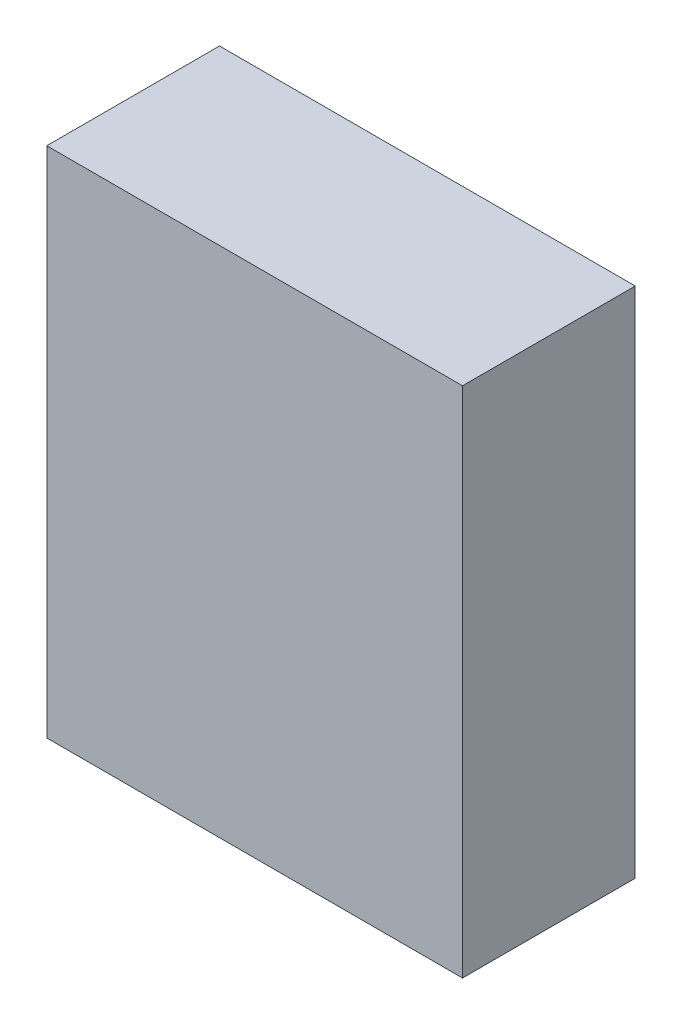
ISO-10303-21;
HEADER;
FILE_DESCRIPTION(('STEP AP214'),'2;1');
FILE_NAME('part.step','',(''),(''),'','','');
FILE_SCHEMA(('AUTOMOTIVE_DESIGN { 1 0 10303 214 1 1 1 1 }'));
ENDSEC;
DATA;
#1=APPLICATION_CONTEXT('core data for automotive mechanical design processes');
#2=APPLICATION_PROTOCOL_DEFINITION('international standard','automotive_design',2000,#1);
#3=PRODUCT_CONTEXT('',#1,'mechanical');
#4=PRODUCT('Part','Part','',(#3));
#5=PRODUCT_RELATED_PRODUCT_CATEGORY('part','',(#4));
#6=PRODUCT_DEFINITION_FORMATION('','',#4);
#7=PRODUCT_DEFINITION_CONTEXT('part definition',#1,'design');
#8=PRODUCT_DEFINITION('design','',#6,#7);
#9=PRODUCT_DEFINITION_SHAPE('','',#8);
#10=(LENGTH_UNIT() NAMED_UNIT(*) SI_UNIT(.MILLI.,.METRE.));
#11=(NAMED_UNIT(*) PLANE_ANGLE_UNIT() SI_UNIT($,.RADIAN.));
#12=(NAMED_UNIT(*) SI_UNIT($,.STERADIAN.) SOLID_ANGLE_UNIT());
#13=UNCERTAINTY_MEASURE_WITH_UNIT(LENGTH_MEASURE(1.E-05),#10,'distance_accuracy_value','');
#14=(GEOMETRIC_REPRESENTATION_CONTEXT(3) GLOBAL_UNCERTAINTY_ASSIGNED_CONTEXT((#13)) GLOBAL_UNIT_ASSIGNED_CONTEXT((#10,
#11,#12)) REPRESENTATION_CONTEXT('',''));
#15=CARTESIAN_POINT('',(0.,0.,0.));
#16=DIRECTION('',(0.,0.,1.));
#17=DIRECTION('',(1.,0.,0.));
#18=AXIS2_PLACEMENT_3D('',#15,#16,#17);
#19=CARTESIAN_POINT('',(-0.1126,0.13765,0.8));
#20=DIRECTION('',(0.,0.,1.));
#21=DIRECTION('',(1.,0.,0.));
#22=AXIS2_PLACEMENT_3D('',#19,#20,#21);
#23=PLANE('',#22);
#24=DIRECTION('',(1.,0.,0.));
#25=VECTOR('',#24,1.);
#26=CARTESIAN_POINT('',(-1.0753,-1.05,0.8));
#27=LINE('',#26,#25);
#28=CARTESIAN_POINT('',(-1.0753,-1.05,0.8));
#29=VERTEX_POINT('',#28);
#30=CARTESIAN_POINT('',(0.8501,-1.05,0.8));
#31=VERTEX_POINT('',#30);
#32=EDGE_CURVE('E78',#29,#31,#27,.T.);
#33=ORIENTED_EDGE('',*,*,#32,.T.);
#34=DIRECTION('',(0.,1.,0.));
#35=VECTOR('',#34,1.);
#36=CARTESIAN_POINT('',(0.8501,-1.05,0.8));
#37=LINE('',#36,#35);
#38=CARTESIAN_POINT('',(0.8501,1.3253,0.8));
#39=VERTEX_POINT('',#38);
#40=EDGE_CURVE('E83',#31,#39,#37,.T.);
#41=ORIENTED_EDGE('',*,*,#40,.T.);
#42=DIRECTION('',(-1.,0.,0.));
#43=VECTOR('',#42,1.);
#44=CARTESIAN_POINT('',(0.8501,1.3253,0.8));
#45=LINE('',#44,#43);
#46=CARTESIAN_POINT('',(-1.0753,1.3253,0.8));
#47=VERTEX_POINT('',#46);
#48=EDGE_CURVE('E104',#39,#47,#45,.T.);
#49=ORIENTED_EDGE('',*,*,#48,.T.);
#50=DIRECTION('',(0.,-1.,0.));
#51=VECTOR('',#50,1.);
#52=CARTESIAN_POINT('',(-1.0753,1.3253,0.8));
#53=LINE('',#52,#51);
#54=EDGE_CURVE('E11',#47,#29,#53,.T.);
#55=ORIENTED_EDGE('',*,*,#54,.T.);
#56=EDGE_LOOP('',(#33,#41,#49,#55));
#57=FACE_BOUND('',#56,.T.);
#58=ADVANCED_FACE('F16',(#57),#23,.T.);
#59=CARTESIAN_POINT('',(-0.1126,0.13765,0.));
#60=DIRECTION('',(0.,0.,1.));
#61=DIRECTION('',(1.,0.,0.));
#62=AXIS2_PLACEMENT_3D('',#59,#60,#61);
#63=PLANE('',#62);
#64=DIRECTION('',(1.,0.,0.));
#65=VECTOR('',#64,1.);
#66=CARTESIAN_POINT('',(-1.0753,-1.05,0.));
#67=LINE('',#66,#65);
#68=CARTESIAN_POINT('',(-1.0753,-1.05,0.));
#69=VERTEX_POINT('',#68);
#70=CARTESIAN_POINT('',(0.8501,-1.05,0.));
#71=VERTEX_POINT('',#70);
#72=EDGE_CURVE('E69',#69,#71,#67,.T.);
#73=ORIENTED_EDGE('',*,*,#72,.F.);
#74=DIRECTION('',(0.,-1.,0.));
#75=VECTOR('',#74,1.);
#76=CARTESIAN_POINT('',(-1.0753,1.3253,0.));
#77=LINE('',#76,#75);
#78=CARTESIAN_POINT('',(-1.0753,1.3253,0.));
#79=VERTEX_POINT('',#78);
#80=EDGE_CURVE('E27',#79,#69,#77,.T.);
#81=ORIENTED_EDGE('',*,*,#80,.F.);
#82=DIRECTION('',(-1.,0.,0.));
#83=VECTOR('',#82,1.);
#84=CARTESIAN_POINT('',(0.8501,1.3253,0.));
#85=LINE('',#84,#83);
#86=CARTESIAN_POINT('',(0.8501,1.3253,0.));
#87=VERTEX_POINT('',#86);
#88=EDGE_CURVE('E72',#87,#79,#85,.T.);
#89=ORIENTED_EDGE('',*,*,#88,.F.);
#90=DIRECTION('',(0.,1.,0.));
#91=VECTOR('',#90,1.);
#92=CARTESIAN_POINT('',(0.8501,-1.05,0.));
#93=LINE('',#92,#91);
#94=EDGE_CURVE('E20',#71,#87,#93,.T.);
#95=ORIENTED_EDGE('',*,*,#94,.F.);
#96=EDGE_LOOP('',(#73,#81,#89,#95));
#97=FACE_BOUND('',#96,.T.);
#98=ADVANCED_FACE('F67',(#97),#63,.F.);
#99=CARTESIAN_POINT('',(-1.0753,1.3253,0.));
#100=DIRECTION('',(1.,0.,0.));
#101=DIRECTION('',(0.,1.,0.));
#102=AXIS2_PLACEMENT_3D('',#99,#100,#101);
#103=PLANE('',#102);
#104=DIRECTION('',(0.,0.,1.));
#105=VECTOR('',#104,1.);
#106=CARTESIAN_POINT('',(-1.0753,1.3253,0.));
#107=LINE('',#106,#105);
#108=EDGE_CURVE('E108',#79,#47,#107,.T.);
#109=ORIENTED_EDGE('',*,*,#108,.F.);
#110=ORIENTED_EDGE('',*,*,#80,.T.);
#111=DIRECTION('',(0.,0.,1.));
#112=VECTOR('',#111,1.);
#113=CARTESIAN_POINT('',(-1.0753,-1.05,0.));
#114=LINE('',#113,#112);
#115=EDGE_CURVE('E90',#69,#29,#114,.T.);
#116=ORIENTED_EDGE('',*,*,#115,.T.);
#117=ORIENTED_EDGE('',*,*,#54,.F.);
#118=EDGE_LOOP('',(#109,#110,#116,#117));
#119=FACE_BOUND('',#118,.T.);
#120=ADVANCED_FACE('F155',(#119),#103,.F.);
#121=CARTESIAN_POINT('',(0.8501,1.3253,0.));
#122=DIRECTION('',(0.,-1.,0.));
#123=DIRECTION('',(0.,0.,-1.));
#124=AXIS2_PLACEMENT_3D('',#121,#122,#123);
#125=PLANE('',#124);
#126=DIRECTION('',(0.,0.,1.));
#127=VECTOR('',#126,1.);
#128=CARTESIAN_POINT('',(0.8501,1.3253,0.));
#129=LINE('',#128,#127);
#130=EDGE_CURVE('E77',#87,#39,#129,.T.);
#131=ORIENTED_EDGE('',*,*,#130,.F.);
#132=ORIENTED_EDGE('',*,*,#88,.T.);
#133=ORIENTED_EDGE('',*,*,#108,.T.);
#134=ORIENTED_EDGE('',*,*,#48,.F.);
#135=EDGE_LOOP('',(#131,#132,#133,#134));
#136=FACE_BOUND('',#135,.T.);
#137=ADVANCED_FACE('F18',(#136),#125,.F.);
#138=CARTESIAN_POINT('',(0.8501,-1.05,0.));
#139=DIRECTION('',(-1.,0.,0.));
#140=DIRECTION('',(0.,0.,1.));
#141=AXIS2_PLACEMENT_3D('',#138,#139,#140);
#142=PLANE('',#141);
#143=DIRECTION('',(0.,0.,1.));
#144=VECTOR('',#143,1.);
#145=CARTESIAN_POINT('',(0.8501,-1.05,0.));
#146=LINE('',#145,#144);
#147=EDGE_CURVE('E80',#71,#31,#146,.T.);
#148=ORIENTED_EDGE('',*,*,#147,.F.);
#149=ORIENTED_EDGE('',*,*,#94,.T.);
#150=ORIENTED_EDGE('',*,*,#130,.T.);
#151=ORIENTED_EDGE('',*,*,#40,.F.);
#152=EDGE_LOOP('',(#148,#149,#150,#151));
#153=FACE_BOUND('',#152,.T.);
#154=ADVANCED_FACE('F81',(#153),#142,.F.);
#155=CARTESIAN_POINT('',(-1.0753,-1.05,0.));
#156=DIRECTION('',(0.,1.,0.));
#157=DIRECTION('',(1.,0.,0.));
#158=AXIS2_PLACEMENT_3D('',#155,#156,#157);
#159=PLANE('',#158);
#160=ORIENTED_EDGE('',*,*,#115,.F.);
#161=ORIENTED_EDGE('',*,*,#72,.T.);
#162=ORIENTED_EDGE('',*,*,#147,.T.);
#163=ORIENTED_EDGE('',*,*,#32,.F.);
#164=EDGE_LOOP('',(#160,#161,#162,#163));
#165=FACE_BOUND('',#164,.T.);
#166=ADVANCED_FACE('F89',(#165),#159,.F.);
#167=CLOSED_SHELL('',(#58,#98,#120,#137,#154,#166));
#168=MANIFOLD_SOLID_BREP('B1',#167);
#169=ADVANCED_BREP_SHAPE_REPRESENTATION('',(#18,#168),#14);
#170=SHAPE_DEFINITION_REPRESENTATION(#9,#169);
ENDSEC;
END-ISO-10303-21;
